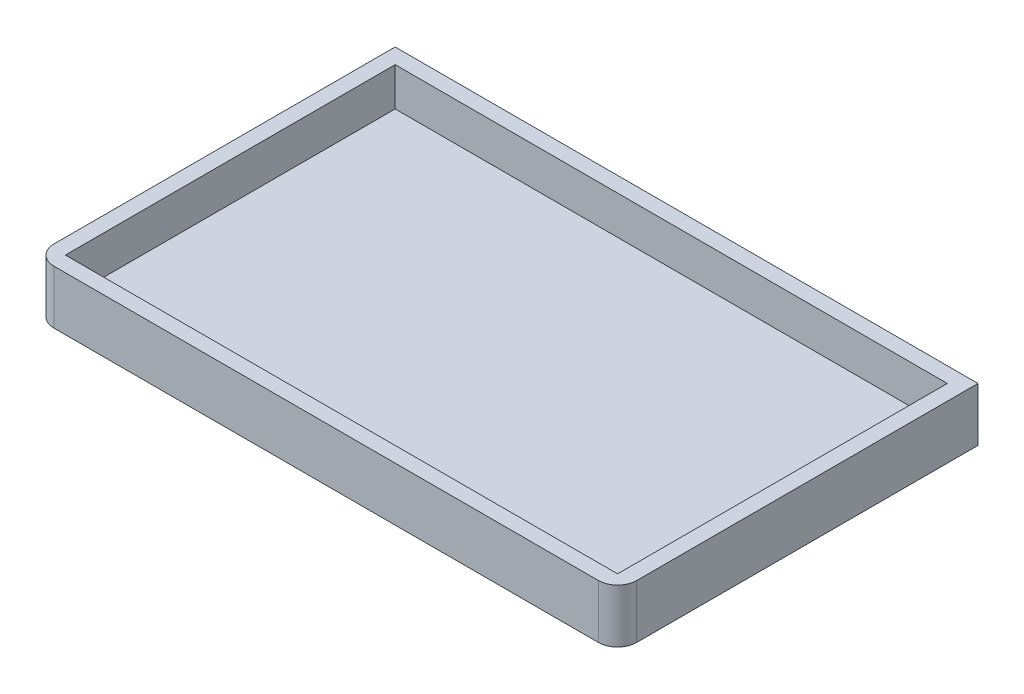
ISO-10303-21;
HEADER;
FILE_DESCRIPTION(('STEP AP214'),'2;1');
FILE_NAME('part.step','',(''),(''),'','','');
FILE_SCHEMA(('AUTOMOTIVE_DESIGN { 1 0 10303 214 1 1 1 1 }'));
ENDSEC;
DATA;
#1=APPLICATION_CONTEXT('core data for automotive mechanical design processes');
#2=APPLICATION_PROTOCOL_DEFINITION('international standard','automotive_design',2000,#1);
#3=PRODUCT_CONTEXT('',#1,'mechanical');
#4=PRODUCT('Part','Part','',(#3));
#5=PRODUCT_RELATED_PRODUCT_CATEGORY('part','',(#4));
#6=PRODUCT_DEFINITION_FORMATION('','',#4);
#7=PRODUCT_DEFINITION_CONTEXT('part definition',#1,'design');
#8=PRODUCT_DEFINITION('design','',#6,#7);
#9=PRODUCT_DEFINITION_SHAPE('','',#8);
#10=(LENGTH_UNIT() NAMED_UNIT(*) SI_UNIT(.MILLI.,.METRE.));
#11=(NAMED_UNIT(*) PLANE_ANGLE_UNIT() SI_UNIT($,.RADIAN.));
#12=(NAMED_UNIT(*) SI_UNIT($,.STERADIAN.) SOLID_ANGLE_UNIT());
#13=UNCERTAINTY_MEASURE_WITH_UNIT(LENGTH_MEASURE(1.E-05),#10,'distance_accuracy_value','');
#14=(GEOMETRIC_REPRESENTATION_CONTEXT(3) GLOBAL_UNCERTAINTY_ASSIGNED_CONTEXT((#13)) GLOBAL_UNIT_ASSIGNED_CONTEXT((#10,
#11,#12)) REPRESENTATION_CONTEXT('',''));
#15=CARTESIAN_POINT('',(0.,0.,0.));
#16=DIRECTION('',(0.,0.,1.));
#17=DIRECTION('',(1.,0.,0.));
#18=AXIS2_PLACEMENT_3D('',#15,#16,#17);
#19=CARTESIAN_POINT('',(0.,0.,4.));
#20=DIRECTION('',(0.,0.,-1.));
#21=DIRECTION('',(-1.,0.,0.));
#22=AXIS2_PLACEMENT_3D('',#19,#20,#21);
#23=PLANE('',#22);
#24=CARTESIAN_POINT('',(37.5,8.,4.));
#25=DIRECTION('',(0.,0.,-1.));
#26=DIRECTION('',(-1.,0.,0.));
#27=AXIS2_PLACEMENT_3D('',#24,#25,#26);
#28=CIRCLE('',#27,3.);
#29=CARTESIAN_POINT('',(34.5,8.,4.));
#30=VERTEX_POINT('',#29);
#31=EDGE_CURVE('E426',#30,#30,#28,.T.);
#32=ORIENTED_EDGE('',*,*,#31,.T.);
#33=EDGE_LOOP('',(#32));
#34=FACE_BOUND('',#33,.T.);
#35=CARTESIAN_POINT('',(12.5,8.,4.));
#36=DIRECTION('',(0.,0.,-1.));
#37=DIRECTION('',(-1.,0.,0.));
#38=AXIS2_PLACEMENT_3D('',#35,#36,#37);
#39=CIRCLE('',#38,3.);
#40=CARTESIAN_POINT('',(9.49999999999999,8.,4.));
#41=VERTEX_POINT('',#40);
#42=EDGE_CURVE('E422',#41,#41,#39,.T.);
#43=ORIENTED_EDGE('',*,*,#42,.T.);
#44=EDGE_LOOP('',(#43));
#45=FACE_BOUND('',#44,.T.);
#46=CARTESIAN_POINT('',(37.5,33.,4.));
#47=DIRECTION('',(0.,0.,-1.));
#48=DIRECTION('',(-1.,0.,0.));
#49=AXIS2_PLACEMENT_3D('',#46,#47,#48);
#50=CIRCLE('',#49,3.);
#51=CARTESIAN_POINT('',(34.5,33.,4.));
#52=VERTEX_POINT('',#51);
#53=EDGE_CURVE('E418',#52,#52,#50,.T.);
#54=ORIENTED_EDGE('',*,*,#53,.T.);
#55=EDGE_LOOP('',(#54));
#56=FACE_BOUND('',#55,.T.);
#57=CARTESIAN_POINT('',(12.5,33.,4.));
#58=DIRECTION('',(0.,0.,-1.));
#59=DIRECTION('',(-1.,0.,0.));
#60=AXIS2_PLACEMENT_3D('',#57,#58,#59);
#61=CIRCLE('',#60,2.99999999999998);
#62=CARTESIAN_POINT('',(9.50000000000002,33.,4.));
#63=VERTEX_POINT('',#62);
#64=EDGE_CURVE('E414',#63,#63,#61,.T.);
#65=ORIENTED_EDGE('',*,*,#64,.T.);
#66=EDGE_LOOP('',(#65));
#67=FACE_BOUND('',#66,.T.);
#68=DIRECTION('',(0.,-1.,0.));
#69=VECTOR('',#68,1.);
#70=CARTESIAN_POINT('',(23.,41.,4.));
#71=LINE('',#70,#69);
#72=CARTESIAN_POINT('',(23.,41.,4.));
#73=VERTEX_POINT('',#72);
#74=CARTESIAN_POINT('',(23.,16.,4.));
#75=VERTEX_POINT('',#74);
#76=EDGE_CURVE('E238',#73,#75,#71,.T.);
#77=ORIENTED_EDGE('',*,*,#76,.F.);
#78=DIRECTION('',(-1.,0.,0.));
#79=VECTOR('',#78,1.);
#80=CARTESIAN_POINT('',(0.,41.,4.));
#81=LINE('',#80,#79);
#82=CARTESIAN_POINT('',(-5.00000000000001,41.,4.));
#83=VERTEX_POINT('',#82);
#84=EDGE_CURVE('E366',#73,#83,#81,.T.);
#85=ORIENTED_EDGE('',*,*,#84,.T.);
#86=CARTESIAN_POINT('',(-5.00000000000001,36.,4.));
#87=DIRECTION('',(0.,0.,-1.));
#88=DIRECTION('',(-1.,0.,0.));
#89=AXIS2_PLACEMENT_3D('',#86,#87,#88);
#90=CIRCLE('',#89,5.);
#91=CARTESIAN_POINT('',(0.,36.,4.));
#92=VERTEX_POINT('',#91);
#93=EDGE_CURVE('E459',#83,#92,#90,.T.);
#94=ORIENTED_EDGE('',*,*,#93,.T.);
#95=DIRECTION('',(0.,-1.,0.));
#96=VECTOR('',#95,1.);
#97=CARTESIAN_POINT('',(0.,0.,4.));
#98=LINE('',#97,#96);
#99=CARTESIAN_POINT('',(0.,0.,4.));
#100=VERTEX_POINT('',#99);
#101=EDGE_CURVE('E356',#92,#100,#98,.T.);
#102=ORIENTED_EDGE('',*,*,#101,.T.);
#103=DIRECTION('',(1.,0.,0.));
#104=VECTOR('',#103,1.);
#105=CARTESIAN_POINT('',(0.,0.,4.));
#106=LINE('',#105,#104);
#107=CARTESIAN_POINT('',(50.,0.,4.));
#108=VERTEX_POINT('',#107);
#109=EDGE_CURVE('E359',#100,#108,#106,.T.);
#110=ORIENTED_EDGE('',*,*,#109,.T.);
#111=DIRECTION('',(0.,1.,0.));
#112=VECTOR('',#111,1.);
#113=CARTESIAN_POINT('',(50.,0.,4.));
#114=LINE('',#113,#112);
#115=CARTESIAN_POINT('',(50.,36.,4.));
#116=VERTEX_POINT('',#115);
#117=EDGE_CURVE('E363',#108,#116,#114,.T.);
#118=ORIENTED_EDGE('',*,*,#117,.T.);
#119=CARTESIAN_POINT('',(55.,36.,4.));
#120=DIRECTION('',(0.,0.,-1.));
#121=DIRECTION('',(-1.,0.,0.));
#122=AXIS2_PLACEMENT_3D('',#119,#120,#121);
#123=CIRCLE('',#122,5.);
#124=CARTESIAN_POINT('',(55.,41.,4.));
#125=VERTEX_POINT('',#124);
#126=EDGE_CURVE('E12',#116,#125,#123,.T.);
#127=ORIENTED_EDGE('',*,*,#126,.T.);
#128=CARTESIAN_POINT('',(27.,41.,4.));
#129=VERTEX_POINT('',#128);
#130=EDGE_CURVE('E236',#125,#129,#81,.T.);
#131=ORIENTED_EDGE('',*,*,#130,.T.);
#132=DIRECTION('',(0.,1.,0.));
#133=VECTOR('',#132,1.);
#134=CARTESIAN_POINT('',(27.,41.,4.));
#135=LINE('',#134,#133);
#136=CARTESIAN_POINT('',(27.,16.,4.));
#137=VERTEX_POINT('',#136);
#138=EDGE_CURVE('E230',#137,#129,#135,.T.);
#139=ORIENTED_EDGE('',*,*,#138,.F.);
#140=DIRECTION('',(1.,0.,0.));
#141=VECTOR('',#140,1.);
#142=CARTESIAN_POINT('',(-66.8943824718764,16.,4.));
#143=LINE('',#142,#141);
#144=EDGE_CURVE('E213',#75,#137,#143,.T.);
#145=ORIENTED_EDGE('',*,*,#144,.F.);
#146=EDGE_LOOP('',(#77,#85,#94,#102,#110,#118,#127,#131,#139,#145));
#147=FACE_BOUND('',#146,.T.);
#148=ADVANCED_FACE('F80',(#34,#45,#56,#67,#147),#23,.F.);
#149=CARTESIAN_POINT('',(0.,41.,0.));
#150=DIRECTION('',(0.,-1.,0.));
#151=DIRECTION('',(0.,0.,-1.));
#152=AXIS2_PLACEMENT_3D('',#149,#150,#151);
#153=PLANE('',#152);
#154=DIRECTION('',(-1.,0.,0.));
#155=VECTOR('',#154,1.);
#156=CARTESIAN_POINT('',(-51.,41.,0.));
#157=LINE('',#156,#155);
#158=CARTESIAN_POINT('',(-5.,41.,0.));
#159=VERTEX_POINT('',#158);
#160=CARTESIAN_POINT('',(-51.,41.,0.));
#161=VERTEX_POINT('',#160);
#162=EDGE_CURVE('E342',#159,#161,#157,.T.);
#163=ORIENTED_EDGE('',*,*,#162,.F.);
#164=DIRECTION('',(0.,0.,-1.));
#165=VECTOR('',#164,1.);
#166=CARTESIAN_POINT('',(-5.00000000000001,41.,0.));
#167=LINE('',#166,#165);
#168=EDGE_CURVE('E450',#159,#83,#167,.F.);
#169=ORIENTED_EDGE('',*,*,#168,.T.);
#170=ORIENTED_EDGE('',*,*,#84,.F.);
#171=DIRECTION('',(0.,0.,-1.));
#172=VECTOR('',#171,1.);
#173=CARTESIAN_POINT('',(23.,41.,84.));
#174=LINE('',#173,#172);
#175=CARTESIAN_POINT('',(23.,41.,68.));
#176=VERTEX_POINT('',#175);
#177=EDGE_CURVE('E243',#176,#73,#174,.T.);
#178=ORIENTED_EDGE('',*,*,#177,.F.);
#179=DIRECTION('',(1.,0.,0.));
#180=VECTOR('',#179,1.);
#181=CARTESIAN_POINT('',(-66.8943824718764,41.,68.));
#182=LINE('',#181,#180);
#183=CARTESIAN_POINT('',(27.,41.,68.));
#184=VERTEX_POINT('',#183);
#185=EDGE_CURVE('E225',#176,#184,#182,.T.);
#186=ORIENTED_EDGE('',*,*,#185,.T.);
#187=DIRECTION('',(0.,0.,-1.));
#188=VECTOR('',#187,1.);
#189=CARTESIAN_POINT('',(27.,41.,84.));
#190=LINE('',#189,#188);
#191=EDGE_CURVE('E232',#184,#129,#190,.T.);
#192=ORIENTED_EDGE('',*,*,#191,.T.);
#193=ORIENTED_EDGE('',*,*,#130,.F.);
#194=DIRECTION('',(0.,0.,-1.));
#195=VECTOR('',#194,1.);
#196=CARTESIAN_POINT('',(55.,41.,0.));
#197=LINE('',#196,#195);
#198=CARTESIAN_POINT('',(55.,41.,0.));
#199=VERTEX_POINT('',#198);
#200=EDGE_CURVE('E446',#125,#199,#197,.T.);
#201=ORIENTED_EDGE('',*,*,#200,.T.);
#202=CARTESIAN_POINT('',(101.,41.,0.));
#203=VERTEX_POINT('',#202);
#204=EDGE_CURVE('E343',#203,#199,#157,.T.);
#205=ORIENTED_EDGE('',*,*,#204,.F.);
#206=DIRECTION('',(0.,0.,-1.));
#207=VECTOR('',#206,1.);
#208=CARTESIAN_POINT('',(101.,41.,0.));
#209=LINE('',#208,#207);
#210=CARTESIAN_POINT('',(101.,41.,89.));
#211=VERTEX_POINT('',#210);
#212=EDGE_CURVE('E339',#211,#203,#209,.T.);
#213=ORIENTED_EDGE('',*,*,#212,.F.);
#214=CARTESIAN_POINT('',(96.,41.,89.));
#215=DIRECTION('',(0.,-1.,0.));
#216=DIRECTION('',(0.,0.,-1.));
#217=AXIS2_PLACEMENT_3D('',#214,#215,#216);
#218=CIRCLE('',#217,5.);
#219=CARTESIAN_POINT('',(96.,41.,94.));
#220=VERTEX_POINT('',#219);
#221=EDGE_CURVE('E391',#211,#220,#218,.T.);
#222=ORIENTED_EDGE('',*,*,#221,.T.);
#223=DIRECTION('',(1.,0.,0.));
#224=VECTOR('',#223,1.);
#225=CARTESIAN_POINT('',(-51.,41.,94.));
#226=LINE('',#225,#224);
#227=CARTESIAN_POINT('',(-46.,41.,94.));
#228=VERTEX_POINT('',#227);
#229=EDGE_CURVE('E270',#228,#220,#226,.T.);
#230=ORIENTED_EDGE('',*,*,#229,.F.);
#231=CARTESIAN_POINT('',(-46.,41.,89.));
#232=DIRECTION('',(0.,-1.,0.));
#233=DIRECTION('',(0.,0.,-1.));
#234=AXIS2_PLACEMENT_3D('',#231,#232,#233);
#235=CIRCLE('',#234,5.);
#236=CARTESIAN_POINT('',(-51.,41.,89.));
#237=VERTEX_POINT('',#236);
#238=EDGE_CURVE('E388',#228,#237,#235,.T.);
#239=ORIENTED_EDGE('',*,*,#238,.T.);
#240=DIRECTION('',(0.,0.,1.));
#241=VECTOR('',#240,1.);
#242=CARTESIAN_POINT('',(-51.,41.,0.));
#243=LINE('',#242,#241);
#244=EDGE_CURVE('E325',#161,#237,#243,.T.);
#245=ORIENTED_EDGE('',*,*,#244,.F.);
#246=EDGE_LOOP('',(#163,#169,#170,#178,#186,#192,#193,#201,#205,#213,#222,#230,#239,#245));
#247=FACE_BOUND('',#246,.T.);
#248=ADVANCED_FACE('F484',(#247),#153,.T.);
#249=CARTESIAN_POINT('',(0.,55.,0.));
#250=DIRECTION('',(0.,-1.,0.));
#251=DIRECTION('',(0.,0.,-1.));
#252=AXIS2_PLACEMENT_3D('',#249,#250,#251);
#253=PLANE('',#252);
#254=DIRECTION('',(1.,0.,0.));
#255=VECTOR('',#254,1.);
#256=CARTESIAN_POINT('',(-51.,55.,94.));
#257=LINE('',#256,#255);
#258=CARTESIAN_POINT('',(-46.,55.,94.));
#259=VERTEX_POINT('',#258);
#260=CARTESIAN_POINT('',(96.,55.,94.));
#261=VERTEX_POINT('',#260);
#262=EDGE_CURVE('E320',#259,#261,#257,.T.);
#263=ORIENTED_EDGE('',*,*,#262,.T.);
#264=CARTESIAN_POINT('',(96.,55.,89.));
#265=DIRECTION('',(0.,-1.,0.));
#266=DIRECTION('',(0.,0.,-1.));
#267=AXIS2_PLACEMENT_3D('',#264,#265,#266);
#268=CIRCLE('',#267,5.);
#269=CARTESIAN_POINT('',(101.,55.,89.));
#270=VERTEX_POINT('',#269);
#271=EDGE_CURVE('E404',#261,#270,#268,.F.);
#272=ORIENTED_EDGE('',*,*,#271,.T.);
#273=DIRECTION('',(0.,0.,-1.));
#274=VECTOR('',#273,1.);
#275=CARTESIAN_POINT('',(101.,55.,0.));
#276=LINE('',#275,#274);
#277=CARTESIAN_POINT('',(101.,55.,0.));
#278=VERTEX_POINT('',#277);
#279=EDGE_CURVE('E324',#270,#278,#276,.T.);
#280=ORIENTED_EDGE('',*,*,#279,.T.);
#281=DIRECTION('',(-1.,0.,0.));
#282=VECTOR('',#281,1.);
#283=CARTESIAN_POINT('',(-51.,55.,0.));
#284=LINE('',#283,#282);
#285=CARTESIAN_POINT('',(-51.,55.,0.));
#286=VERTEX_POINT('',#285);
#287=EDGE_CURVE('E328',#278,#286,#284,.T.);
#288=ORIENTED_EDGE('',*,*,#287,.T.);
#289=DIRECTION('',(0.,0.,1.));
#290=VECTOR('',#289,1.);
#291=CARTESIAN_POINT('',(-51.,55.,0.));
#292=LINE('',#291,#290);
#293=CARTESIAN_POINT('',(-51.,55.,89.));
#294=VERTEX_POINT('',#293);
#295=EDGE_CURVE('E331',#286,#294,#292,.T.);
#296=ORIENTED_EDGE('',*,*,#295,.T.);
#297=CARTESIAN_POINT('',(-46.,55.,89.));
#298=DIRECTION('',(0.,-1.,0.));
#299=DIRECTION('',(0.,0.,-1.));
#300=AXIS2_PLACEMENT_3D('',#297,#298,#299);
#301=CIRCLE('',#300,5.);
#302=EDGE_CURVE('E401',#294,#259,#301,.F.);
#303=ORIENTED_EDGE('',*,*,#302,.T.);
#304=EDGE_LOOP('',(#263,#272,#280,#288,#296,#303));
#305=FACE_BOUND('',#304,.T.);
#306=DIRECTION('',(0.,0.,1.));
#307=VECTOR('',#306,1.);
#308=CARTESIAN_POINT('',(-47.,55.,4.00000000000001));
#309=LINE('',#308,#307);
#310=CARTESIAN_POINT('',(-47.,55.,4.00000000000001));
#311=VERTEX_POINT('',#310);
#312=CARTESIAN_POINT('',(-47.,55.,90.));
#313=VERTEX_POINT('',#312);
#314=EDGE_CURVE('E258',#311,#313,#309,.T.);
#315=ORIENTED_EDGE('',*,*,#314,.F.);
#316=DIRECTION('',(-1.,0.,0.));
#317=VECTOR('',#316,1.);
#318=CARTESIAN_POINT('',(97.,55.,4.00000000000001));
#319=LINE('',#318,#317);
#320=CARTESIAN_POINT('',(97.,55.,4.00000000000001));
#321=VERTEX_POINT('',#320);
#322=EDGE_CURVE('E297',#321,#311,#319,.T.);
#323=ORIENTED_EDGE('',*,*,#322,.F.);
#324=DIRECTION('',(0.,0.,-1.));
#325=VECTOR('',#324,1.);
#326=CARTESIAN_POINT('',(97.,55.,90.));
#327=LINE('',#326,#325);
#328=CARTESIAN_POINT('',(97.,55.,90.));
#329=VERTEX_POINT('',#328);
#330=EDGE_CURVE('E278',#329,#321,#327,.T.);
#331=ORIENTED_EDGE('',*,*,#330,.F.);
#332=DIRECTION('',(1.,0.,0.));
#333=VECTOR('',#332,1.);
#334=CARTESIAN_POINT('',(-47.,55.,90.));
#335=LINE('',#334,#333);
#336=EDGE_CURVE('E266',#313,#329,#335,.T.);
#337=ORIENTED_EDGE('',*,*,#336,.F.);
#338=EDGE_LOOP('',(#315,#323,#331,#337));
#339=FACE_BOUND('',#338,.T.);
#340=ADVANCED_FACE('F496',(#305,#339),#253,.F.);
#341=CARTESIAN_POINT('',(0.,0.,4.));
#342=DIRECTION('',(1.,0.,0.));
#343=DIRECTION('',(0.,1.,0.));
#344=AXIS2_PLACEMENT_3D('',#341,#342,#343);
#345=PLANE('',#344);
#346=ORIENTED_EDGE('',*,*,#101,.F.);
#347=DIRECTION('',(0.,0.,-1.));
#348=VECTOR('',#347,1.);
#349=CARTESIAN_POINT('',(0.,36.,4.));
#350=LINE('',#349,#348);
#351=CARTESIAN_POINT('',(0.,36.,0.));
#352=VERTEX_POINT('',#351);
#353=EDGE_CURVE('E442',#92,#352,#350,.T.);
#354=ORIENTED_EDGE('',*,*,#353,.T.);
#355=DIRECTION('',(0.,-1.,0.));
#356=VECTOR('',#355,1.);
#357=CARTESIAN_POINT('',(0.,0.,0.));
#358=LINE('',#357,#356);
#359=CARTESIAN_POINT('',(0.,0.,0.));
#360=VERTEX_POINT('',#359);
#361=EDGE_CURVE('E355',#352,#360,#358,.T.);
#362=ORIENTED_EDGE('',*,*,#361,.T.);
#363=DIRECTION('',(0.,0.,-1.));
#364=VECTOR('',#363,1.);
#365=CARTESIAN_POINT('',(0.,0.,4.));
#366=LINE('',#365,#364);
#367=EDGE_CURVE('E380',#100,#360,#366,.T.);
#368=ORIENTED_EDGE('',*,*,#367,.F.);
#369=EDGE_LOOP('',(#346,#354,#362,#368));
#370=FACE_BOUND('',#369,.T.);
#371=ADVANCED_FACE('F519',(#370),#345,.F.);
#372=CARTESIAN_POINT('',(0.,0.,4.));
#373=DIRECTION('',(0.,1.,0.));
#374=DIRECTION('',(0.,0.,1.));
#375=AXIS2_PLACEMENT_3D('',#372,#373,#374);
#376=PLANE('',#375);
#377=DIRECTION('',(0.,0.,-1.));
#378=VECTOR('',#377,1.);
#379=CARTESIAN_POINT('',(50.,0.,4.));
#380=LINE('',#379,#378);
#381=CARTESIAN_POINT('',(50.,0.,0.));
#382=VERTEX_POINT('',#381);
#383=EDGE_CURVE('E369',#108,#382,#380,.T.);
#384=ORIENTED_EDGE('',*,*,#383,.F.);
#385=ORIENTED_EDGE('',*,*,#109,.F.);
#386=ORIENTED_EDGE('',*,*,#367,.T.);
#387=DIRECTION('',(1.,0.,0.));
#388=VECTOR('',#387,1.);
#389=CARTESIAN_POINT('',(0.,0.,0.));
#390=LINE('',#389,#388);
#391=EDGE_CURVE('E372',#360,#382,#390,.T.);
#392=ORIENTED_EDGE('',*,*,#391,.T.);
#393=EDGE_LOOP('',(#384,#385,#386,#392));
#394=FACE_BOUND('',#393,.T.);
#395=ADVANCED_FACE('F516',(#394),#376,.F.);
#396=CARTESIAN_POINT('',(50.,0.,4.));
#397=DIRECTION('',(-1.,0.,0.));
#398=DIRECTION('',(0.,-1.,0.));
#399=AXIS2_PLACEMENT_3D('',#396,#397,#398);
#400=PLANE('',#399);
#401=DIRECTION('',(0.,1.,0.));
#402=VECTOR('',#401,1.);
#403=CARTESIAN_POINT('',(50.,0.,0.));
#404=LINE('',#403,#402);
#405=CARTESIAN_POINT('',(50.,36.,0.));
#406=VERTEX_POINT('',#405);
#407=EDGE_CURVE('E360',#382,#406,#404,.T.);
#408=ORIENTED_EDGE('',*,*,#407,.T.);
#409=DIRECTION('',(0.,0.,-1.));
#410=VECTOR('',#409,1.);
#411=CARTESIAN_POINT('',(50.,36.,4.));
#412=LINE('',#411,#410);
#413=EDGE_CURVE('E96',#406,#116,#412,.F.);
#414=ORIENTED_EDGE('',*,*,#413,.T.);
#415=ORIENTED_EDGE('',*,*,#117,.F.);
#416=ORIENTED_EDGE('',*,*,#383,.T.);
#417=EDGE_LOOP('',(#408,#414,#415,#416));
#418=FACE_BOUND('',#417,.T.);
#419=ADVANCED_FACE('F512',(#418),#400,.F.);
#420=CARTESIAN_POINT('',(0.,0.,0.));
#421=DIRECTION('',(0.,0.,-1.));
#422=DIRECTION('',(-1.,0.,0.));
#423=AXIS2_PLACEMENT_3D('',#420,#421,#422);
#424=PLANE('',#423);
#425=CARTESIAN_POINT('',(12.5,33.,0.));
#426=DIRECTION('',(0.,0.,-1.));
#427=DIRECTION('',(-1.,0.,0.));
#428=AXIS2_PLACEMENT_3D('',#425,#426,#427);
#429=CIRCLE('',#428,2.);
#430=CARTESIAN_POINT('',(10.5,33.,0.));
#431=VERTEX_POINT('',#430);
#432=EDGE_CURVE('E468',#431,#431,#429,.F.);
#433=ORIENTED_EDGE('',*,*,#432,.T.);
#434=EDGE_LOOP('',(#433));
#435=FACE_BOUND('',#434,.T.);
#436=CARTESIAN_POINT('',(37.5,33.,0.));
#437=DIRECTION('',(0.,0.,-1.));
#438=DIRECTION('',(-1.,0.,0.));
#439=AXIS2_PLACEMENT_3D('',#436,#437,#438);
#440=CIRCLE('',#439,2.);
#441=CARTESIAN_POINT('',(35.5,33.,0.));
#442=VERTEX_POINT('',#441);
#443=EDGE_CURVE('E465',#442,#442,#440,.F.);
#444=ORIENTED_EDGE('',*,*,#443,.T.);
#445=EDGE_LOOP('',(#444));
#446=FACE_BOUND('',#445,.T.);
#447=CARTESIAN_POINT('',(37.5,8.,0.));
#448=DIRECTION('',(0.,0.,-1.));
#449=DIRECTION('',(-1.,0.,0.));
#450=AXIS2_PLACEMENT_3D('',#447,#448,#449);
#451=CIRCLE('',#450,2.);
#452=CARTESIAN_POINT('',(35.5,8.,0.));
#453=VERTEX_POINT('',#452);
#454=EDGE_CURVE('E463',#453,#453,#451,.F.);
#455=ORIENTED_EDGE('',*,*,#454,.T.);
#456=EDGE_LOOP('',(#455));
#457=FACE_BOUND('',#456,.T.);
#458=CARTESIAN_POINT('',(12.5,8.,0.));
#459=DIRECTION('',(0.,0.,-1.));
#460=DIRECTION('',(-1.,0.,0.));
#461=AXIS2_PLACEMENT_3D('',#458,#459,#460);
#462=CIRCLE('',#461,2.);
#463=CARTESIAN_POINT('',(10.5,8.,0.));
#464=VERTEX_POINT('',#463);
#465=EDGE_CURVE('E234',#464,#464,#462,.F.);
#466=ORIENTED_EDGE('',*,*,#465,.T.);
#467=EDGE_LOOP('',(#466));
#468=FACE_BOUND('',#467,.T.);
#469=ORIENTED_EDGE('',*,*,#361,.F.);
#470=CARTESIAN_POINT('',(-5.00000000000001,36.,0.));
#471=DIRECTION('',(0.,0.,-1.));
#472=DIRECTION('',(-1.,0.,0.));
#473=AXIS2_PLACEMENT_3D('',#470,#471,#472);
#474=CIRCLE('',#473,5.);
#475=EDGE_CURVE('E456',#352,#159,#474,.F.);
#476=ORIENTED_EDGE('',*,*,#475,.T.);
#477=ORIENTED_EDGE('',*,*,#162,.T.);
#478=DIRECTION('',(0.,-1.,0.));
#479=VECTOR('',#478,1.);
#480=CARTESIAN_POINT('',(-51.,55.,0.));
#481=LINE('',#480,#479);
#482=EDGE_CURVE('E335',#286,#161,#481,.T.);
#483=ORIENTED_EDGE('',*,*,#482,.F.);
#484=ORIENTED_EDGE('',*,*,#287,.F.);
#485=DIRECTION('',(0.,-1.,0.));
#486=VECTOR('',#485,1.);
#487=CARTESIAN_POINT('',(101.,55.,0.));
#488=LINE('',#487,#486);
#489=EDGE_CURVE('E351',#278,#203,#488,.T.);
#490=ORIENTED_EDGE('',*,*,#489,.T.);
#491=ORIENTED_EDGE('',*,*,#204,.T.);
#492=CARTESIAN_POINT('',(55.,36.,0.));
#493=DIRECTION('',(0.,0.,-1.));
#494=DIRECTION('',(-1.,0.,0.));
#495=AXIS2_PLACEMENT_3D('',#492,#493,#494);
#496=CIRCLE('',#495,5.);
#497=EDGE_CURVE('E89',#199,#406,#496,.F.);
#498=ORIENTED_EDGE('',*,*,#497,.T.);
#499=ORIENTED_EDGE('',*,*,#407,.F.);
#500=ORIENTED_EDGE('',*,*,#391,.F.);
#501=EDGE_LOOP('',(#469,#476,#477,#483,#484,#490,#491,#498,#499,#500));
#502=FACE_BOUND('',#501,.T.);
#503=ADVANCED_FACE('F475',(#435,#446,#457,#468,#502),#424,.T.);
#504=CARTESIAN_POINT('',(-51.,55.,94.));
#505=DIRECTION('',(0.,0.,-1.));
#506=DIRECTION('',(-1.,0.,0.));
#507=AXIS2_PLACEMENT_3D('',#504,#505,#506);
#508=PLANE('',#507);
#509=ORIENTED_EDGE('',*,*,#229,.T.);
#510=DIRECTION('',(0.,-1.,0.));
#511=VECTOR('',#510,1.);
#512=CARTESIAN_POINT('',(96.,55.,94.));
#513=LINE('',#512,#511);
#514=EDGE_CURVE('E398',#220,#261,#513,.F.);
#515=ORIENTED_EDGE('',*,*,#514,.T.);
#516=ORIENTED_EDGE('',*,*,#262,.F.);
#517=DIRECTION('',(0.,-1.,0.));
#518=VECTOR('',#517,1.);
#519=CARTESIAN_POINT('',(-46.,55.,94.));
#520=LINE('',#519,#518);
#521=EDGE_CURVE('E394',#259,#228,#520,.T.);
#522=ORIENTED_EDGE('',*,*,#521,.T.);
#523=EDGE_LOOP('',(#509,#515,#516,#522));
#524=FACE_BOUND('',#523,.T.);
#525=ADVANCED_FACE('F492',(#524),#508,.F.);
#526=CARTESIAN_POINT('',(101.,55.,0.));
#527=DIRECTION('',(-1.,0.,0.));
#528=DIRECTION('',(0.,0.,1.));
#529=AXIS2_PLACEMENT_3D('',#526,#527,#528);
#530=PLANE('',#529);
#531=ORIENTED_EDGE('',*,*,#279,.F.);
#532=DIRECTION('',(0.,-1.,0.));
#533=VECTOR('',#532,1.);
#534=CARTESIAN_POINT('',(101.,55.,89.));
#535=LINE('',#534,#533);
#536=EDGE_CURVE('E384',#270,#211,#535,.T.);
#537=ORIENTED_EDGE('',*,*,#536,.T.);
#538=ORIENTED_EDGE('',*,*,#212,.T.);
#539=ORIENTED_EDGE('',*,*,#489,.F.);
#540=EDGE_LOOP('',(#531,#537,#538,#539));
#541=FACE_BOUND('',#540,.T.);
#542=ADVANCED_FACE('F504',(#541),#530,.F.);
#543=CARTESIAN_POINT('',(-51.,55.,0.));
#544=DIRECTION('',(1.,0.,0.));
#545=DIRECTION('',(0.,0.,-1.));
#546=AXIS2_PLACEMENT_3D('',#543,#544,#545);
#547=PLANE('',#546);
#548=ORIENTED_EDGE('',*,*,#244,.T.);
#549=DIRECTION('',(0.,-1.,0.));
#550=VECTOR('',#549,1.);
#551=CARTESIAN_POINT('',(-51.,55.,89.));
#552=LINE('',#551,#550);
#553=EDGE_CURVE('E407',#237,#294,#552,.F.);
#554=ORIENTED_EDGE('',*,*,#553,.T.);
#555=ORIENTED_EDGE('',*,*,#295,.F.);
#556=ORIENTED_EDGE('',*,*,#482,.T.);
#557=EDGE_LOOP('',(#548,#554,#555,#556));
#558=FACE_BOUND('',#557,.T.);
#559=ADVANCED_FACE('F482',(#558),#547,.F.);
#560=CARTESIAN_POINT('',(0.,45.,0.));
#561=DIRECTION('',(0.,-1.,0.));
#562=DIRECTION('',(0.,0.,-1.));
#563=AXIS2_PLACEMENT_3D('',#560,#561,#562);
#564=PLANE('',#563);
#565=DIRECTION('',(1.,0.,0.));
#566=VECTOR('',#565,1.);
#567=CARTESIAN_POINT('',(-47.,45.,90.));
#568=LINE('',#567,#566);
#569=CARTESIAN_POINT('',(-47.,45.,90.));
#570=VERTEX_POINT('',#569);
#571=CARTESIAN_POINT('',(97.,45.,90.));
#572=VERTEX_POINT('',#571);
#573=EDGE_CURVE('E271',#570,#572,#568,.T.);
#574=ORIENTED_EDGE('',*,*,#573,.T.);
#575=DIRECTION('',(0.,0.,-1.));
#576=VECTOR('',#575,1.);
#577=CARTESIAN_POINT('',(97.,45.,90.));
#578=LINE('',#577,#576);
#579=CARTESIAN_POINT('',(97.,45.,4.00000000000001));
#580=VERTEX_POINT('',#579);
#581=EDGE_CURVE('E279',#572,#580,#578,.T.);
#582=ORIENTED_EDGE('',*,*,#581,.T.);
#583=DIRECTION('',(-1.,0.,0.));
#584=VECTOR('',#583,1.);
#585=CARTESIAN_POINT('',(97.,45.,4.00000000000001));
#586=LINE('',#585,#584);
#587=CARTESIAN_POINT('',(-47.,45.,4.00000000000001));
#588=VERTEX_POINT('',#587);
#589=EDGE_CURVE('E257',#580,#588,#586,.T.);
#590=ORIENTED_EDGE('',*,*,#589,.T.);
#591=DIRECTION('',(0.,0.,1.));
#592=VECTOR('',#591,1.);
#593=CARTESIAN_POINT('',(-47.,45.,4.00000000000001));
#594=LINE('',#593,#592);
#595=EDGE_CURVE('E252',#588,#570,#594,.T.);
#596=ORIENTED_EDGE('',*,*,#595,.T.);
#597=EDGE_LOOP('',(#574,#582,#590,#596));
#598=FACE_BOUND('',#597,.T.);
#599=ADVANCED_FACE('F566',(#598),#564,.F.);
#600=CARTESIAN_POINT('',(-47.,55.,4.00000000000001));
#601=DIRECTION('',(1.,0.,0.));
#602=DIRECTION('',(0.,0.,-1.));
#603=AXIS2_PLACEMENT_3D('',#600,#601,#602);
#604=PLANE('',#603);
#605=ORIENTED_EDGE('',*,*,#595,.F.);
#606=DIRECTION('',(0.,-1.,0.));
#607=VECTOR('',#606,1.);
#608=CARTESIAN_POINT('',(-47.,55.,4.00000000000001));
#609=LINE('',#608,#607);
#610=EDGE_CURVE('E263',#311,#588,#609,.T.);
#611=ORIENTED_EDGE('',*,*,#610,.F.);
#612=ORIENTED_EDGE('',*,*,#314,.T.);
#613=DIRECTION('',(0.,-1.,0.));
#614=VECTOR('',#613,1.);
#615=CARTESIAN_POINT('',(-47.,55.,90.));
#616=LINE('',#615,#614);
#617=EDGE_CURVE('E253',#313,#570,#616,.T.);
#618=ORIENTED_EDGE('',*,*,#617,.T.);
#619=EDGE_LOOP('',(#605,#611,#612,#618));
#620=FACE_BOUND('',#619,.T.);
#621=ADVANCED_FACE('F799',(#620),#604,.T.);
#622=CARTESIAN_POINT('',(97.,55.,4.00000000000001));
#623=DIRECTION('',(0.,0.,1.));
#624=DIRECTION('',(1.,0.,0.));
#625=AXIS2_PLACEMENT_3D('',#622,#623,#624);
#626=PLANE('',#625);
#627=ORIENTED_EDGE('',*,*,#589,.F.);
#628=DIRECTION('',(0.,-1.,0.));
#629=VECTOR('',#628,1.);
#630=CARTESIAN_POINT('',(97.,55.,4.00000000000001));
#631=LINE('',#630,#629);
#632=EDGE_CURVE('E300',#321,#580,#631,.T.);
#633=ORIENTED_EDGE('',*,*,#632,.F.);
#634=ORIENTED_EDGE('',*,*,#322,.T.);
#635=ORIENTED_EDGE('',*,*,#610,.T.);
#636=EDGE_LOOP('',(#627,#633,#634,#635));
#637=FACE_BOUND('',#636,.T.);
#638=ADVANCED_FACE('F789',(#637),#626,.T.);
#639=CARTESIAN_POINT('',(97.,55.,90.));
#640=DIRECTION('',(-1.,0.,0.));
#641=DIRECTION('',(0.,0.,1.));
#642=AXIS2_PLACEMENT_3D('',#639,#640,#641);
#643=PLANE('',#642);
#644=ORIENTED_EDGE('',*,*,#581,.F.);
#645=DIRECTION('',(0.,-1.,0.));
#646=VECTOR('',#645,1.);
#647=CARTESIAN_POINT('',(97.,55.,90.));
#648=LINE('',#647,#646);
#649=EDGE_CURVE('E274',#329,#572,#648,.T.);
#650=ORIENTED_EDGE('',*,*,#649,.F.);
#651=ORIENTED_EDGE('',*,*,#330,.T.);
#652=ORIENTED_EDGE('',*,*,#632,.T.);
#653=EDGE_LOOP('',(#644,#650,#651,#652));
#654=FACE_BOUND('',#653,.T.);
#655=ADVANCED_FACE('F779',(#654),#643,.T.);
#656=CARTESIAN_POINT('',(-47.,55.,90.));
#657=DIRECTION('',(0.,0.,-1.));
#658=DIRECTION('',(-1.,0.,0.));
#659=AXIS2_PLACEMENT_3D('',#656,#657,#658);
#660=PLANE('',#659);
#661=ORIENTED_EDGE('',*,*,#573,.F.);
#662=ORIENTED_EDGE('',*,*,#617,.F.);
#663=ORIENTED_EDGE('',*,*,#336,.T.);
#664=ORIENTED_EDGE('',*,*,#649,.T.);
#665=EDGE_LOOP('',(#661,#662,#663,#664));
#666=FACE_BOUND('',#665,.T.);
#667=ADVANCED_FACE('F565',(#666),#660,.T.);
#668=CARTESIAN_POINT('',(96.,55.,89.));
#669=DIRECTION('',(0.,-1.,0.));
#670=DIRECTION('',(0.,0.,-1.));
#671=AXIS2_PLACEMENT_3D('',#668,#669,#670);
#672=CYLINDRICAL_SURFACE('',#671,5.);
#673=ORIENTED_EDGE('',*,*,#271,.F.);
#674=ORIENTED_EDGE('',*,*,#514,.F.);
#675=ORIENTED_EDGE('',*,*,#221,.F.);
#676=ORIENTED_EDGE('',*,*,#536,.F.);
#677=EDGE_LOOP('',(#673,#674,#675,#676));
#678=FACE_BOUND('',#677,.T.);
#679=ADVANCED_FACE('F501',(#678),#672,.T.);
#680=CARTESIAN_POINT('',(-46.,55.,89.));
#681=DIRECTION('',(0.,-1.,0.));
#682=DIRECTION('',(0.,0.,-1.));
#683=AXIS2_PLACEMENT_3D('',#680,#681,#682);
#684=CYLINDRICAL_SURFACE('',#683,5.);
#685=ORIENTED_EDGE('',*,*,#302,.F.);
#686=ORIENTED_EDGE('',*,*,#553,.F.);
#687=ORIENTED_EDGE('',*,*,#238,.F.);
#688=ORIENTED_EDGE('',*,*,#521,.F.);
#689=EDGE_LOOP('',(#685,#686,#687,#688));
#690=FACE_BOUND('',#689,.T.);
#691=ADVANCED_FACE('F489',(#690),#684,.T.);
#692=CARTESIAN_POINT('',(27.,41.,84.));
#693=DIRECTION('',(-1.,0.,0.));
#694=DIRECTION('',(0.,0.,1.));
#695=AXIS2_PLACEMENT_3D('',#692,#693,#694);
#696=PLANE('',#695);
#697=ORIENTED_EDGE('',*,*,#191,.F.);
#698=DIRECTION('',(0.,0.363850527140476,0.931457349479619));
#699=VECTOR('',#698,1.);
#700=CARTESIAN_POINT('',(27.,41.,68.));
#701=LINE('',#700,#699);
#702=EDGE_CURVE('E216',#137,#184,#701,.T.);
#703=ORIENTED_EDGE('',*,*,#702,.F.);
#704=ORIENTED_EDGE('',*,*,#138,.T.);
#705=EDGE_LOOP('',(#697,#703,#704));
#706=FACE_BOUND('',#705,.T.);
#707=ADVANCED_FACE('F229',(#706),#696,.F.);
#708=CARTESIAN_POINT('',(23.,41.,84.));
#709=DIRECTION('',(1.,0.,0.));
#710=DIRECTION('',(0.,0.,-1.));
#711=AXIS2_PLACEMENT_3D('',#708,#709,#710);
#712=PLANE('',#711);
#713=ORIENTED_EDGE('',*,*,#76,.T.);
#714=DIRECTION('',(0.,-0.363850527140476,-0.931457349479619));
#715=VECTOR('',#714,1.);
#716=CARTESIAN_POINT('',(23.,41.,68.));
#717=LINE('',#716,#715);
#718=EDGE_CURVE('E219',#176,#75,#717,.T.);
#719=ORIENTED_EDGE('',*,*,#718,.F.);
#720=ORIENTED_EDGE('',*,*,#177,.T.);
#721=EDGE_LOOP('',(#713,#719,#720));
#722=FACE_BOUND('',#721,.T.);
#723=ADVANCED_FACE('F535',(#722),#712,.F.);
#724=CARTESIAN_POINT('',(-66.8943824718764,41.,68.));
#725=DIRECTION('',(0.,0.931457349479619,-0.363850527140476));
#726=DIRECTION('',(0.,0.363850527140476,0.931457349479619));
#727=AXIS2_PLACEMENT_3D('',#724,#725,#726);
#728=PLANE('',#727);
#729=ORIENTED_EDGE('',*,*,#718,.T.);
#730=ORIENTED_EDGE('',*,*,#144,.T.);
#731=ORIENTED_EDGE('',*,*,#702,.T.);
#732=ORIENTED_EDGE('',*,*,#185,.F.);
#733=EDGE_LOOP('',(#729,#730,#731,#732));
#734=FACE_BOUND('',#733,.T.);
#735=ADVANCED_FACE('F215',(#734),#728,.F.);
#736=CARTESIAN_POINT('',(12.5,8.,-5.65685424949239));
#737=DIRECTION('',(0.,0.,1.));
#738=DIRECTION('',(1.,0.,0.));
#739=AXIS2_PLACEMENT_3D('',#736,#737,#738);
#740=CYLINDRICAL_SURFACE('',#739,2.);
#741=CARTESIAN_POINT('',(12.5,8.,2.99999999999999));
#742=DIRECTION('',(0.,0.,-1.));
#743=DIRECTION('',(-1.,0.,0.));
#744=AXIS2_PLACEMENT_3D('',#741,#742,#743);
#745=CIRCLE('',#744,2.);
#746=CARTESIAN_POINT('',(10.5,8.,2.99999999999999));
#747=VERTEX_POINT('',#746);
#748=EDGE_CURVE('E430',#747,#747,#745,.F.);
#749=ORIENTED_EDGE('',*,*,#748,.T.);
#750=EDGE_LOOP('',(#749));
#751=FACE_BOUND('',#750,.T.);
#752=ORIENTED_EDGE('',*,*,#465,.F.);
#753=EDGE_LOOP('',(#752));
#754=FACE_BOUND('',#753,.T.);
#755=ADVANCED_FACE('F541',(#751,#754),#740,.F.);
#756=CARTESIAN_POINT('',(37.5,8.,-5.65685424949239));
#757=DIRECTION('',(0.,0.,1.));
#758=DIRECTION('',(1.,0.,0.));
#759=AXIS2_PLACEMENT_3D('',#756,#757,#758);
#760=CYLINDRICAL_SURFACE('',#759,2.);
#761=CARTESIAN_POINT('',(37.5,8.,2.99999999999999));
#762=DIRECTION('',(0.,0.,-1.));
#763=DIRECTION('',(-1.,0.,0.));
#764=AXIS2_PLACEMENT_3D('',#761,#762,#763);
#765=CIRCLE('',#764,2.);
#766=CARTESIAN_POINT('',(35.5,8.,2.99999999999999));
#767=VERTEX_POINT('',#766);
#768=EDGE_CURVE('E410',#767,#767,#765,.F.);
#769=ORIENTED_EDGE('',*,*,#768,.T.);
#770=EDGE_LOOP('',(#769));
#771=FACE_BOUND('',#770,.T.);
#772=ORIENTED_EDGE('',*,*,#454,.F.);
#773=EDGE_LOOP('',(#772));
#774=FACE_BOUND('',#773,.T.);
#775=ADVANCED_FACE('F685',(#771,#774),#760,.F.);
#776=CARTESIAN_POINT('',(37.5,33.,-5.65685424949239));
#777=DIRECTION('',(0.,0.,1.));
#778=DIRECTION('',(1.,0.,0.));
#779=AXIS2_PLACEMENT_3D('',#776,#777,#778);
#780=CYLINDRICAL_SURFACE('',#779,2.);
#781=CARTESIAN_POINT('',(37.5,33.,2.99999999999999));
#782=DIRECTION('',(0.,0.,-1.));
#783=DIRECTION('',(-1.,0.,0.));
#784=AXIS2_PLACEMENT_3D('',#781,#782,#783);
#785=CIRCLE('',#784,2.);
#786=CARTESIAN_POINT('',(35.5,33.,2.99999999999999));
#787=VERTEX_POINT('',#786);
#788=EDGE_CURVE('E434',#787,#787,#785,.F.);
#789=ORIENTED_EDGE('',*,*,#788,.T.);
#790=EDGE_LOOP('',(#789));
#791=FACE_BOUND('',#790,.T.);
#792=ORIENTED_EDGE('',*,*,#443,.F.);
#793=EDGE_LOOP('',(#792));
#794=FACE_BOUND('',#793,.T.);
#795=ADVANCED_FACE('F675',(#791,#794),#780,.F.);
#796=CARTESIAN_POINT('',(12.5,33.,-5.65685424949239));
#797=DIRECTION('',(0.,0.,1.));
#798=DIRECTION('',(1.,0.,0.));
#799=AXIS2_PLACEMENT_3D('',#796,#797,#798);
#800=CYLINDRICAL_SURFACE('',#799,2.);
#801=CARTESIAN_POINT('',(12.5,33.,3.00000000000002));
#802=DIRECTION('',(0.,0.,-1.));
#803=DIRECTION('',(-1.,0.,0.));
#804=AXIS2_PLACEMENT_3D('',#801,#802,#803);
#805=CIRCLE('',#804,2.);
#806=CARTESIAN_POINT('',(10.5,33.,3.00000000000002));
#807=VERTEX_POINT('',#806);
#808=EDGE_CURVE('E438',#807,#807,#805,.F.);
#809=ORIENTED_EDGE('',*,*,#808,.T.);
#810=EDGE_LOOP('',(#809));
#811=FACE_BOUND('',#810,.T.);
#812=ORIENTED_EDGE('',*,*,#432,.F.);
#813=EDGE_LOOP('',(#812));
#814=FACE_BOUND('',#813,.T.);
#815=ADVANCED_FACE('F577',(#811,#814),#800,.F.);
#816=CARTESIAN_POINT('',(37.5,8.,2.99999999999999));
#817=DIRECTION('',(0.,0.,1.));
#818=DIRECTION('',(1.,0.,0.));
#819=AXIS2_PLACEMENT_3D('',#816,#817,#818);
#820=CONICAL_SURFACE('',#819,2.,0.785398163397445);
#821=ORIENTED_EDGE('',*,*,#31,.F.);
#822=EDGE_LOOP('',(#821));
#823=FACE_BOUND('',#822,.T.);
#824=ORIENTED_EDGE('',*,*,#768,.F.);
#825=EDGE_LOOP('',(#824));
#826=FACE_BOUND('',#825,.T.);
#827=ADVANCED_FACE('F570',(#823,#826),#820,.F.);
#828=CARTESIAN_POINT('',(12.5,8.,2.99999999999999));
#829=DIRECTION('',(0.,0.,1.));
#830=DIRECTION('',(1.,0.,0.));
#831=AXIS2_PLACEMENT_3D('',#828,#829,#830);
#832=CONICAL_SURFACE('',#831,2.,0.785398163397445);
#833=ORIENTED_EDGE('',*,*,#42,.F.);
#834=EDGE_LOOP('',(#833));
#835=FACE_BOUND('',#834,.T.);
#836=ORIENTED_EDGE('',*,*,#748,.F.);
#837=EDGE_LOOP('',(#836));
#838=FACE_BOUND('',#837,.T.);
#839=ADVANCED_FACE('F576',(#835,#838),#832,.F.);
#840=CARTESIAN_POINT('',(37.5,33.,2.99999999999999));
#841=DIRECTION('',(0.,0.,1.));
#842=DIRECTION('',(1.,0.,0.));
#843=AXIS2_PLACEMENT_3D('',#840,#841,#842);
#844=CONICAL_SURFACE('',#843,2.,0.785398163397445);
#845=ORIENTED_EDGE('',*,*,#53,.F.);
#846=EDGE_LOOP('',(#845));
#847=FACE_BOUND('',#846,.T.);
#848=ORIENTED_EDGE('',*,*,#788,.F.);
#849=EDGE_LOOP('',(#848));
#850=FACE_BOUND('',#849,.T.);
#851=ADVANCED_FACE('F584',(#847,#850),#844,.F.);
#852=CARTESIAN_POINT('',(12.5,33.,3.00000000000002));
#853=DIRECTION('',(0.,0.,1.));
#854=DIRECTION('',(1.,0.,0.));
#855=AXIS2_PLACEMENT_3D('',#852,#853,#854);
#856=CONICAL_SURFACE('',#855,2.,0.785398163397445);
#857=ORIENTED_EDGE('',*,*,#64,.F.);
#858=EDGE_LOOP('',(#857));
#859=FACE_BOUND('',#858,.T.);
#860=ORIENTED_EDGE('',*,*,#808,.F.);
#861=EDGE_LOOP('',(#860));
#862=FACE_BOUND('',#861,.T.);
#863=ADVANCED_FACE('F591',(#859,#862),#856,.F.);
#864=CARTESIAN_POINT('',(-5.00000000000001,36.,4.));
#865=DIRECTION('',(0.,0.,-1.));
#866=DIRECTION('',(-1.,0.,0.));
#867=AXIS2_PLACEMENT_3D('',#864,#865,#866);
#868=CYLINDRICAL_SURFACE('',#867,5.);
#869=ORIENTED_EDGE('',*,*,#93,.F.);
#870=ORIENTED_EDGE('',*,*,#168,.F.);
#871=ORIENTED_EDGE('',*,*,#475,.F.);
#872=ORIENTED_EDGE('',*,*,#353,.F.);
#873=EDGE_LOOP('',(#869,#870,#871,#872));
#874=FACE_BOUND('',#873,.T.);
#875=ADVANCED_FACE('F523',(#874),#868,.F.);
#876=CARTESIAN_POINT('',(55.,36.,0.));
#877=DIRECTION('',(0.,0.,-1.));
#878=DIRECTION('',(-1.,0.,0.));
#879=AXIS2_PLACEMENT_3D('',#876,#877,#878);
#880=CYLINDRICAL_SURFACE('',#879,5.);
#881=ORIENTED_EDGE('',*,*,#126,.F.);
#882=ORIENTED_EDGE('',*,*,#413,.F.);
#883=ORIENTED_EDGE('',*,*,#497,.F.);
#884=ORIENTED_EDGE('',*,*,#200,.F.);
#885=EDGE_LOOP('',(#881,#882,#883,#884));
#886=FACE_BOUND('',#885,.T.);
#887=ADVANCED_FACE('F82',(#886),#880,.F.);
#888=CLOSED_SHELL('',(#148,#248,#340,#371,#395,#419,#503,#525,#542,#559,#599,#621,#638,#655,
#667,#679,#691,#707,#723,#735,#755,#775,#795,#815,#827,#839,#851,#863,#875,#887));
#889=MANIFOLD_SOLID_BREP('B2',#888);
#890=ADVANCED_BREP_SHAPE_REPRESENTATION('',(#18,#889),#14);
#891=SHAPE_DEFINITION_REPRESENTATION(#9,#890);
ENDSEC;
END-ISO-10303-21;
